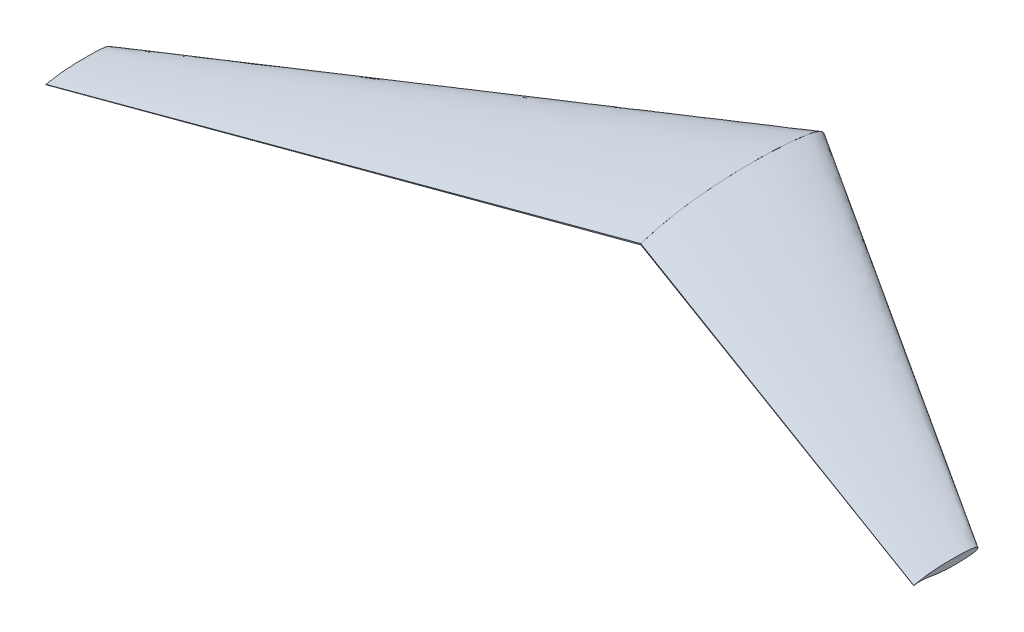
ISO-10303-21;
HEADER;
FILE_DESCRIPTION(('STEP AP214'),'2;1');
FILE_NAME('part.step','',(''),(''),'','','');
FILE_SCHEMA(('AUTOMOTIVE_DESIGN { 1 0 10303 214 1 1 1 1 }'));
ENDSEC;
DATA;
#1=APPLICATION_CONTEXT('core data for automotive mechanical design processes');
#2=APPLICATION_PROTOCOL_DEFINITION('international standard','automotive_design',2000,#1);
#3=PRODUCT_CONTEXT('',#1,'mechanical');
#4=PRODUCT('Part','Part','',(#3));
#5=PRODUCT_RELATED_PRODUCT_CATEGORY('part','',(#4));
#6=PRODUCT_DEFINITION_FORMATION('','',#4);
#7=PRODUCT_DEFINITION_CONTEXT('part definition',#1,'design');
#8=PRODUCT_DEFINITION('design','',#6,#7);
#9=PRODUCT_DEFINITION_SHAPE('','',#8);
#10=(LENGTH_UNIT() NAMED_UNIT(*) SI_UNIT(.MILLI.,.METRE.));
#11=(NAMED_UNIT(*) PLANE_ANGLE_UNIT() SI_UNIT($,.RADIAN.));
#12=(NAMED_UNIT(*) SI_UNIT($,.STERADIAN.) SOLID_ANGLE_UNIT());
#13=UNCERTAINTY_MEASURE_WITH_UNIT(LENGTH_MEASURE(1.E-05),#10,'distance_accuracy_value','');
#14=(GEOMETRIC_REPRESENTATION_CONTEXT(3) GLOBAL_UNCERTAINTY_ASSIGNED_CONTEXT((#13)) GLOBAL_UNIT_ASSIGNED_CONTEXT((#10,
#11,#12)) REPRESENTATION_CONTEXT('',''));
#15=CARTESIAN_POINT('',(0.,0.,0.));
#16=DIRECTION('',(0.,0.,1.));
#17=DIRECTION('',(1.,0.,0.));
#18=AXIS2_PLACEMENT_3D('',#15,#16,#17);
#19=CARTESIAN_POINT('',(0.,0.,0.));
#20=DIRECTION('',(1.,0.,0.));
#21=DIRECTION('',(0.,-0.0162840972649137,0.999867405297456));
#22=AXIS2_PLACEMENT_3D('',#19,#20,#21);
#23=PLANE('',#22);
#24=CARTESIAN_POINT('',(0.,0.,0.));
#25=CARTESIAN_POINT('',(0.,-168.219244985559,24.4306824349386));
#26=CARTESIAN_POINT('',(0.,-240.293252777775,157.991066940026));
#27=CARTESIAN_POINT('',(0.,-287.941682209285,301.889929005835));
#28=CARTESIAN_POINT('',(0.,-292.101499857276,314.960555971875));
#29=CARTESIAN_POINT('',(0.,-310.76378046373,374.505096564794));
#30=CARTESIAN_POINT('',(0.,-327.241640239006,436.068046062058));
#31=CARTESIAN_POINT('',(0.,-355.189334027052,557.429659927653));
#32=CARTESIAN_POINT('',(0.,-369.357094330206,632.30081132304));
#33=CARTESIAN_POINT('',(0.,-382.942468731832,713.000713621617));
#34=CARTESIAN_POINT('',(0.,-386.339419512408,733.843007246593));
#35=CARTESIAN_POINT('',(0.,-464.151707553221,1219.93749628057));
#36=CARTESIAN_POINT('',(0.,-497.989254236309,1718.43084410729));
#37=CARTESIAN_POINT('',(0.,-514.963696980453,2222.47962112165));
#38=CARTESIAN_POINT('',(0.,-515.506742264564,2239.10762908759));
#39=CARTESIAN_POINT('',(0.,-531.576610615847,2741.14533979813));
#40=CARTESIAN_POINT('',(0.,-531.338306486109,3237.12493062856));
#41=CARTESIAN_POINT('',(0.,-484.471823951836,3730.48170300638));
#42=CARTESIAN_POINT('',(0.,-483.443845808145,3741.1157622821));
#43=CARTESIAN_POINT('',(0.,-434.699780159024,4238.95693823703));
#44=CARTESIAN_POINT('',(0.,-338.479144088492,4727.75824414844));
#45=CARTESIAN_POINT('',(0.,-231.889492315737,5222.67458438554));
#46=CARTESIAN_POINT('',(0.,-230.091058568289,5231.0164483081));
#47=CARTESIAN_POINT('',(0.,-174.510415982621,5488.4887692628));
#48=CARTESIAN_POINT('',(0.,-5.08441114977858,6242.80148239056));
#49=CARTESIAN_POINT('',(0.,37.3131454345689,6997.03429239929));
#50=CARTESIAN_POINT('',(0.,-122.099983023939,7497.11766190782));
#51=B_SPLINE_CURVE_WITH_KNOTS('',3,(#24,#25,#26,#27,#28,#29,#30,#31,#32,#33,#34,#35,#36,#37,#38,
#39,#40,#41,#42,#43,#44,#45,#46,#47,#48,#49,#50),.UNSPECIFIED.,.F.,.F.,(4,1,1,1,1,1,1,1,1,1,1,1,
1,1,1,1,1,1,1,1,1,1,1,1,4),(0.,0.0516818959266183,0.0546217915879629,0.0563634907676497,
0.0568022946260039,0.0779742802769757,0.0808417609968839,0.105440526394511,0.108219422965478,
0.113370916210949,0.113833768892824,0.303753868139358,0.306383441939405,0.309593352148186,
0.310212468355379,0.501400140634165,0.503114766214556,0.504759280947049,0.50559428152025,
0.699493646754859,0.699693785804065,0.701848021766534,0.702801294739028,0.801775017183419,1.),.UNSPECIFIED.);
#52=CARTESIAN_POINT('',(0.,0.,0.));
#53=VERTEX_POINT('',#52);
#54=CARTESIAN_POINT('',(0.,-122.099983023939,7497.11766190782));
#55=VERTEX_POINT('',#54);
#56=EDGE_CURVE('E13',#53,#55,#51,.T.);
#57=ORIENTED_EDGE('',*,*,#56,.F.);
#58=CARTESIAN_POINT('',(0.,0.,0.));
#59=CARTESIAN_POINT('',(0.,147.744350315997,-1.87596635575002));
#60=CARTESIAN_POINT('',(0.,229.950494983549,150.159617470069));
#61=CARTESIAN_POINT('',(0.,283.89468774049,304.222194415367));
#62=CARTESIAN_POINT('',(0.,288.576874017886,318.12055456744));
#63=CARTESIAN_POINT('',(0.,309.494568260285,381.203954901813));
#64=CARTESIAN_POINT('',(0.,326.920125838408,444.214037180333));
#65=CARTESIAN_POINT('',(0.,354.958515805397,565.577583143327));
#66=CARTESIAN_POINT('',(0.,368.038013798109,638.61302207588));
#67=CARTESIAN_POINT('',(0.,380.410222664183,717.251532881619));
#68=CARTESIAN_POINT('',(0.,383.500957238236,737.571327655632));
#69=CARTESIAN_POINT('',(0.,454.59746271917,1212.13403568743));
#70=CARTESIAN_POINT('',(0.,494.430085188347,1719.94356679038));
#71=CARTESIAN_POINT('',(0.,512.783132070054,2227.12746801325));
#72=CARTESIAN_POINT('',(0.,513.366711958921,2243.85221273865));
#73=CARTESIAN_POINT('',(0.,530.55662166064,2748.66902372671));
#74=CARTESIAN_POINT('',(0.,526.204487529615,3240.45712521648));
#75=CARTESIAN_POINT('',(0.,508.019006864098,3736.75276621331));
#76=CARTESIAN_POINT('',(0.,507.621796677391,3747.45291604525));
#77=CARTESIAN_POINT('',(0.,488.846145002536,4248.48463209584));
#78=CARTESIAN_POINT('',(0.,456.331207739767,4747.931323017));
#79=CARTESIAN_POINT('',(0.,398.620723946864,5247.76477091847));
#80=CARTESIAN_POINT('',(0.,397.642967454545,5256.18831885992));
#81=CARTESIAN_POINT('',(0.,367.258396148628,5516.1319341748));
#82=CARTESIAN_POINT('',(0.,258.861807301948,6272.94786771452));
#83=CARTESIAN_POINT('',(0.,82.1439686634919,7014.10396158884));
#84=CARTESIAN_POINT('',(0.,-75.5439842046241,7497.11766190782));
#85=B_SPLINE_CURVE_WITH_KNOTS('',3,(#58,#59,#60,#61,#62,#63,#64,#65,#66,#67,#68,#69,#70,#71,#72,
#73,#74,#75,#76,#77,#78,#79,#80,#81,#82,#83,#84),.UNSPECIFIED.,.F.,.F.,(4,1,1,1,1,1,1,1,1,1,1,1,
1,1,1,1,1,1,1,1,1,1,1,1,4),(0.,0.0516818959266183,0.0546217915879629,0.0563634907676497,
0.0568022946260039,0.0779742802769757,0.0808417609968839,0.105440526394511,0.108219422965478,
0.113370916210949,0.113833768892824,0.303753868139358,0.306383441939405,0.309593352148186,
0.310212468355379,0.501400140634165,0.503114766214556,0.504759280947049,0.50559428152025,
0.699493646754859,0.699693785804065,0.701848021766534,0.702801294739028,0.801775017183419,1.),.UNSPECIFIED.);
#86=CARTESIAN_POINT('',(0.,-75.5439842046241,7497.11766190782));
#87=VERTEX_POINT('',#86);
#88=EDGE_CURVE('E89',#87,#53,#85,.F.);
#89=ORIENTED_EDGE('',*,*,#88,.F.);
#90=DIRECTION('',(0.,1.,0.));
#91=VECTOR('',#90,1.);
#92=CARTESIAN_POINT('',(0.,-98.8219836142816,7497.11766190782));
#93=LINE('',#92,#91);
#94=EDGE_CURVE('E74',#55,#87,#93,.T.);
#95=ORIENTED_EDGE('',*,*,#94,.F.);
#96=EDGE_LOOP('',(#57,#89,#95));
#97=FACE_BOUND('',#96,.T.);
#98=ADVANCED_FACE('F73',(#97),#23,.T.);
#99=OPEN_SHELL('',(#98));
#100=SHELL_BASED_SURFACE_MODEL('B2',(#99));
#101=CARTESIAN_POINT('',(-17711.940475464,-15.8130514374712,14068.2664031076));
#102=DIRECTION('',(-1.,0.,0.));
#103=DIRECTION('',(0.,0.00602622616138376,-0.999981842134272));
#104=AXIS2_PLACEMENT_3D('',#101,#102,#103);
#105=PLANE('',#104);
#106=CARTESIAN_POINT('',(-17711.940475464,-15.8130514374712,14068.2664031076));
#107=CARTESIAN_POINT('',(-17711.940475464,41.3944573956827,13808.8497174991));
#108=CARTESIAN_POINT('',(-17711.940475464,81.3294975090124,13545.1127401605));
#109=CARTESIAN_POINT('',(-17711.940475464,118.313912795888,13108.497152444));
#110=CARTESIAN_POINT('',(-17711.940475464,125.638180271525,12933.165113035));
#111=CARTESIAN_POINT('',(-17711.940475464,132.289914098428,12587.9188844221));
#112=CARTESIAN_POINT('',(-17711.940475464,131.845992853705,12409.687296129));
#113=CARTESIAN_POINT('',(-17711.940475464,126.798865744636,12067.3135180284));
#114=CARTESIAN_POINT('',(-17711.940475464,122.008531395881,11888.0995964154));
#115=CARTESIAN_POINT('',(-17711.940475464,95.2060162132103,11687.3207423543));
#116=CARTESIAN_POINT('',(-17711.940475464,87.4335696718086,11636.5027445196));
#117=CARTESIAN_POINT('',(-17711.940475464,82.8166994266646,11592.776350498));
#118=CARTESIAN_POINT('',(-17711.940475464,62.8941371107513,11520.2820314438));
#119=CARTESIAN_POINT('',(-17711.940475464,22.8509522508046,11449.683428606));
#120=CARTESIAN_POINT('',(-17711.940475464,0.,11444.2752214398));
#121=B_SPLINE_CURVE_WITH_KNOTS('',3,(#106,#107,#108,#109,#110,#111,#112,#113,#114,#115,#116,
#117,#118,#119,#120),.UNSPECIFIED.,.F.,.F.,(4,1,1,1,1,1,1,1,1,1,1,1,4),(0.,0.300306214195935,
0.300506353245141,0.495240719052951,0.498599859365835,0.690406647851814,0.696246131860642,
0.886629083789051,0.894559473605489,0.922025719723024,0.94363650923235,0.948318104073382,1.),.UNSPECIFIED.);
#122=CARTESIAN_POINT('',(-17711.940475464,0.,11444.2752214398));
#123=VERTEX_POINT('',#122);
#124=CARTESIAN_POINT('',(-17711.940475464,-15.8130514374712,14068.2664031076));
#125=VERTEX_POINT('',#124);
#126=EDGE_CURVE('E230',#123,#125,#121,.F.);
#127=ORIENTED_EDGE('',*,*,#126,.F.);
#128=CARTESIAN_POINT('',(-17711.940475464,0.,11444.2752214398));
#129=CARTESIAN_POINT('',(-17711.940475464,-47.818557129653,11446.9972277219));
#130=CARTESIAN_POINT('',(-17711.940475464,-63.0903884514529,11514.9937546275));
#131=CARTESIAN_POINT('',(-17711.940475464,-78.3886634121315,11590.3487551736));
#132=CARTESIAN_POINT('',(-17711.940475464,-86.6397036490906,11634.4554990894));
#133=CARTESIAN_POINT('',(-17711.940475464,-93.2729643868783,11685.3168945833));
#134=CARTESIAN_POINT('',(-17711.940475464,-116.962708154297,11886.0989316644));
#135=CARTESIAN_POINT('',(-17711.940475464,-124.768790117039,12064.06661987));
#136=CARTESIAN_POINT('',(-17711.940475464,-131.747537065342,12408.7396195625));
#137=CARTESIAN_POINT('',(-17711.940475464,-131.076895392797,12585.9621770555));
#138=CARTESIAN_POINT('',(-17711.940475464,-110.923731359257,12933.1723140875));
#139=CARTESIAN_POINT('',(-17711.940475464,-90.8918341756138,13109.5736224428));
#140=CARTESIAN_POINT('',(-17711.940475464,-48.2087782371968,13368.8391971416));
#141=CARTESIAN_POINT('',(-17711.940475464,1.18684815978902,13628.6530130911));
#142=CARTESIAN_POINT('',(-17711.940475464,11.6483985730418,13895.1026446759));
#143=CARTESIAN_POINT('',(-17711.940475464,-29.3719819061615,14068.2664031076));
#144=B_SPLINE_CURVE_WITH_KNOTS('',3,(#128,#129,#130,#131,#132,#133,#134,#135,#136,#137,#138,
#139,#140,#141,#142,#143),.UNSPECIFIED.,.F.,.F.,(4,1,1,1,1,1,1,1,1,1,1,1,1,4),(0.,
0.0546217915879629,0.0568022946260039,0.0808417609968839,0.108219422965478,0.113833768892824,
0.306383441939405,0.310212468355379,0.503114766214556,0.50559428152025,0.701848021766534,
0.702801294739028,0.801775017183419,1.),.UNSPECIFIED.);
#145=CARTESIAN_POINT('',(-17711.940475464,-29.3719819061615,14068.2664031076));
#146=VERTEX_POINT('',#145);
#147=EDGE_CURVE('E162',#146,#123,#144,.F.);
#148=ORIENTED_EDGE('',*,*,#147,.F.);
#149=DIRECTION('',(0.,-1.,0.));
#150=VECTOR('',#149,1.);
#151=CARTESIAN_POINT('',(-17711.940475464,-15.8130514374713,14068.2664031076));
#152=LINE('',#151,#150);
#153=EDGE_CURVE('E130',#125,#146,#152,.T.);
#154=ORIENTED_EDGE('',*,*,#153,.F.);
#155=EDGE_LOOP('',(#127,#148,#154));
#156=FACE_BOUND('',#155,.T.);
#157=ADVANCED_FACE('F127',(#156),#105,.T.);
#158=CARTESIAN_POINT('',(17711.940475464,-15.8130514374712,14068.2664031076));
#159=DIRECTION('',(1.,0.,0.));
#160=DIRECTION('',(0.,0.00602622616138376,-0.999981842134272));
#161=AXIS2_PLACEMENT_3D('',#158,#159,#160);
#162=PLANE('',#161);
#163=CARTESIAN_POINT('',(17711.940475464,-15.8130514374712,14068.2664031076));
#164=CARTESIAN_POINT('',(17711.940475464,41.3944573956827,13808.8497174991));
#165=CARTESIAN_POINT('',(17711.940475464,81.3294975090124,13545.1127401605));
#166=CARTESIAN_POINT('',(17711.940475464,118.313912795888,13108.497152444));
#167=CARTESIAN_POINT('',(17711.940475464,125.638180271525,12933.165113035));
#168=CARTESIAN_POINT('',(17711.940475464,132.289914098428,12587.9188844221));
#169=CARTESIAN_POINT('',(17711.940475464,131.845992853705,12409.687296129));
#170=CARTESIAN_POINT('',(17711.940475464,126.798865744636,12067.3135180284));
#171=CARTESIAN_POINT('',(17711.940475464,122.008531395881,11888.0995964154));
#172=CARTESIAN_POINT('',(17711.940475464,95.2060162132103,11687.3207423543));
#173=CARTESIAN_POINT('',(17711.940475464,87.4335696718086,11636.5027445196));
#174=CARTESIAN_POINT('',(17711.940475464,82.8166994266646,11592.776350498));
#175=CARTESIAN_POINT('',(17711.940475464,62.8941371107513,11520.2820314438));
#176=CARTESIAN_POINT('',(17711.940475464,22.8509522508046,11449.683428606));
#177=CARTESIAN_POINT('',(17711.940475464,0.,11444.2752214398));
#178=B_SPLINE_CURVE_WITH_KNOTS('',3,(#163,#164,#165,#166,#167,#168,#169,#170,#171,#172,#173,
#174,#175,#176,#177),.UNSPECIFIED.,.F.,.F.,(4,1,1,1,1,1,1,1,1,1,1,1,4),(0.,0.300306214195935,
0.300506353245141,0.495240719052951,0.498599859365835,0.690406647851814,0.696246131860642,
0.886629083789051,0.894559473605489,0.922025719723024,0.94363650923235,0.948318104073382,1.),.UNSPECIFIED.);
#179=CARTESIAN_POINT('',(17711.940475464,0.,11444.2752214398));
#180=VERTEX_POINT('',#179);
#181=CARTESIAN_POINT('',(17711.940475464,-15.8130514374712,14068.2664031076));
#182=VERTEX_POINT('',#181);
#183=EDGE_CURVE('E179',#180,#182,#178,.F.);
#184=ORIENTED_EDGE('',*,*,#183,.T.);
#185=DIRECTION('',(0.,-1.,0.));
#186=VECTOR('',#185,1.);
#187=CARTESIAN_POINT('',(17711.940475464,-15.8130514374713,14068.2664031076));
#188=LINE('',#187,#186);
#189=CARTESIAN_POINT('',(17711.940475464,-29.3719819061615,14068.2664031076));
#190=VERTEX_POINT('',#189);
#191=EDGE_CURVE('E137',#182,#190,#188,.T.);
#192=ORIENTED_EDGE('',*,*,#191,.T.);
#193=CARTESIAN_POINT('',(17711.940475464,0.,11444.2752214398));
#194=CARTESIAN_POINT('',(17711.940475464,-47.818557129653,11446.9972277219));
#195=CARTESIAN_POINT('',(17711.940475464,-63.0903884514529,11514.9937546275));
#196=CARTESIAN_POINT('',(17711.940475464,-78.3886634121315,11590.3487551736));
#197=CARTESIAN_POINT('',(17711.940475464,-86.6397036490906,11634.4554990894));
#198=CARTESIAN_POINT('',(17711.940475464,-93.2729643868783,11685.3168945833));
#199=CARTESIAN_POINT('',(17711.940475464,-116.962708154297,11886.0989316644));
#200=CARTESIAN_POINT('',(17711.940475464,-124.768790117039,12064.06661987));
#201=CARTESIAN_POINT('',(17711.940475464,-131.747537065342,12408.7396195625));
#202=CARTESIAN_POINT('',(17711.940475464,-131.076895392797,12585.9621770555));
#203=CARTESIAN_POINT('',(17711.940475464,-110.923731359257,12933.1723140875));
#204=CARTESIAN_POINT('',(17711.940475464,-90.8918341756138,13109.5736224428));
#205=CARTESIAN_POINT('',(17711.940475464,-48.2087782371968,13368.8391971416));
#206=CARTESIAN_POINT('',(17711.940475464,1.18684815978902,13628.6530130911));
#207=CARTESIAN_POINT('',(17711.940475464,11.6483985730418,13895.1026446759));
#208=CARTESIAN_POINT('',(17711.940475464,-29.3719819061615,14068.2664031076));
#209=B_SPLINE_CURVE_WITH_KNOTS('',3,(#193,#194,#195,#196,#197,#198,#199,#200,#201,#202,#203,
#204,#205,#206,#207,#208),.UNSPECIFIED.,.F.,.F.,(4,1,1,1,1,1,1,1,1,1,1,1,1,4),(0.,
0.0546217915879629,0.0568022946260039,0.0808417609968839,0.108219422965478,0.113833768892824,
0.306383441939405,0.310212468355379,0.503114766214556,0.50559428152025,0.701848021766534,
0.702801294739028,0.801775017183419,1.),.UNSPECIFIED.);
#210=EDGE_CURVE('E175',#190,#180,#209,.F.);
#211=ORIENTED_EDGE('',*,*,#210,.T.);
#212=EDGE_LOOP('',(#184,#192,#211));
#213=FACE_BOUND('',#212,.T.);
#214=ADVANCED_FACE('F177',(#213),#162,.T.);
#215=CARTESIAN_POINT('',(2444.91600832248,0.,6590.05122428721));
#216=DIRECTION('',(0.34783428390117,0.,0.937556030828537));
#217=DIRECTION('',(0.937556030828537,0.,-0.34783428390117));
#218=AXIS2_PLACEMENT_3D('',#215,#216,#217);
#219=PLANE('',#218);
#220=DIRECTION('',(0.937551344586137,-0.00316175499837554,-0.347832545300259));
#221=VECTOR('',#220,1.);
#222=CARTESIAN_POINT('',(-8855.970237732,-45.6785178210476,10782.6920325077));
#223=LINE('',#222,#221);
#224=CARTESIAN_POINT('',(0.,-75.5439842046241,7497.11766190782));
#225=VERTEX_POINT('',#224);
#226=EDGE_CURVE('E236',#125,#225,#223,.T.);
#227=ORIENTED_EDGE('',*,*,#226,.F.);
#228=ORIENTED_EDGE('',*,*,#153,.T.);
#229=DIRECTION('',(-0.937544736943559,0.00490836391053259,0.34783009385784));
#230=VECTOR('',#229,1.);
#231=CARTESIAN_POINT('',(-8855.970237732,-75.7359824650503,10782.6920325077));
#232=LINE('',#231,#230);
#233=CARTESIAN_POINT('',(0.,-122.099983023939,7497.11766190782));
#234=VERTEX_POINT('',#233);
#235=EDGE_CURVE('E246',#234,#146,#232,.T.);
#236=ORIENTED_EDGE('',*,*,#235,.F.);
#237=DIRECTION('',(0.,-1.,0.));
#238=VECTOR('',#237,1.);
#239=CARTESIAN_POINT('',(0.,-75.5439842046226,7497.11766190782));
#240=LINE('',#239,#238);
#241=EDGE_CURVE('E71',#225,#234,#240,.T.);
#242=ORIENTED_EDGE('',*,*,#241,.F.);
#243=EDGE_LOOP('',(#227,#228,#236,#242));
#244=FACE_BOUND('',#243,.T.);
#245=ADVANCED_FACE('F255',(#244),#219,.T.);
#246=CARTESIAN_POINT('',(0.,0.,0.));
#247=CARTESIAN_POINT('',(-17711.940475464,0.,11444.2752214398));
#248=CARTESIAN_POINT('',(0.,-177.788302382174,25.8204081020493));
#249=CARTESIAN_POINT('',(-17711.940475464,-47.818557129653,11446.9972277219));
#250=CARTESIAN_POINT('',(0.,-246.485948710704,171.085912968349));
#251=CARTESIAN_POINT('',(-17711.940475464,-63.0903884514529,11514.9937546275));
#252=CARTESIAN_POINT('',(0.,-311.912015004825,377.44430817759));
#253=CARTESIAN_POINT('',(-17711.940475464,-78.3886634121315,11590.3487551736));
#254=CARTESIAN_POINT('',(0.,-347.09591396304,511.99499932436));
#255=CARTESIAN_POINT('',(-17711.940475464,-86.6397036490906,11634.4554990894));
#256=CARTESIAN_POINT('',(0.,-373.198588527806,653.061349223909));
#257=CARTESIAN_POINT('',(-17711.940475464,-93.2729643868783,11685.3168945833));
#258=CARTESIAN_POINT('',(0.,-464.310856576101,1213.16292025647));
#259=CARTESIAN_POINT('',(-17711.940475464,-116.962708154297,11886.0989316644));
#260=CARTESIAN_POINT('',(0.,-499.101668502809,1735.12009555467));
#261=CARTESIAN_POINT('',(-17711.940475464,-124.768790117039,12064.06661987));
#262=CARTESIAN_POINT('',(0.,-531.724252638484,2737.33294474881));
#263=CARTESIAN_POINT('',(-17711.940475464,-131.747537065342,12408.7396195625));
#264=CARTESIAN_POINT('',(0.,-531.33000610697,3247.87374350738));
#265=CARTESIAN_POINT('',(-17711.940475464,-131.076895392797,12585.9621770555));
#266=CARTESIAN_POINT('',(0.,-434.932009966432,4240.80242948856));
#267=CARTESIAN_POINT('',(-17711.940475464,-110.923731359257,12933.1723140875));
#268=CARTESIAN_POINT('',(0.,-335.773317959958,4741.45289985921));
#269=CARTESIAN_POINT('',(-17711.940475464,-90.8918341756138,13109.5736224428));
#270=CARTESIAN_POINT('',(0.,-174.510415982621,5488.4887692628));
#271=CARTESIAN_POINT('',(-17711.940475464,-48.2087782371968,13368.8391971416));
#272=CARTESIAN_POINT('',(0.,-5.08441114977858,6242.80148239056));
#273=CARTESIAN_POINT('',(-17711.940475464,1.18684815978902,13628.6530130911));
#274=CARTESIAN_POINT('',(0.,37.3131454345689,6997.03429239929));
#275=CARTESIAN_POINT('',(-17711.940475464,11.6483985730418,13895.1026446759));
#276=CARTESIAN_POINT('',(0.,-122.099983023939,7497.11766190782));
#277=CARTESIAN_POINT('',(-17711.940475464,-29.3719819061615,14068.2664031076));
#278=B_SPLINE_SURFACE_WITH_KNOTS('',3,1,((#246,#247),(#248,#249),(#250,#251),(#252,#253),(#254,
#255),(#256,#257),(#258,#259),(#260,#261),(#262,#263),(#264,#265),(#266,#267),(#268,#269),(#270,
#271),(#272,#273),(#274,#275),(#276,#277)),.UNSPECIFIED.,.F.,.F.,.F.,(4,1,1,1,1,1,1,1,1,1,1,1,1,
4),(2,2),(0.,0.0546217915879629,0.0568022946260039,0.0808417609968839,0.108219422965478,
0.113833768892824,0.306383441939405,0.310212468355379,0.503114766214556,0.50559428152025,
0.701848021766534,0.702801294739028,0.801775017183419,1.),(0.,1.),.UNSPECIFIED.);
#279=CARTESIAN_POINT('',(0.,0.,0.));
#280=CARTESIAN_POINT('',(0.,-177.788302382174,25.8204081020493));
#281=CARTESIAN_POINT('',(0.,-246.485948710704,171.085912968349));
#282=CARTESIAN_POINT('',(0.,-311.912015004825,377.44430817759));
#283=CARTESIAN_POINT('',(0.,-347.09591396304,511.99499932436));
#284=CARTESIAN_POINT('',(0.,-373.198588527806,653.061349223909));
#285=CARTESIAN_POINT('',(0.,-464.310856576101,1213.16292025647));
#286=CARTESIAN_POINT('',(0.,-499.101668502809,1735.12009555467));
#287=CARTESIAN_POINT('',(0.,-531.724252638484,2737.33294474881));
#288=CARTESIAN_POINT('',(0.,-531.33000610697,3247.87374350738));
#289=CARTESIAN_POINT('',(0.,-434.932009966432,4240.80242948856));
#290=CARTESIAN_POINT('',(0.,-335.773317959958,4741.45289985921));
#291=CARTESIAN_POINT('',(0.,-174.510415982621,5488.4887692628));
#292=CARTESIAN_POINT('',(0.,-5.08441114977858,6242.80148239056));
#293=CARTESIAN_POINT('',(0.,37.3131454345689,6997.03429239929));
#294=CARTESIAN_POINT('',(0.,-122.099983023939,7497.11766190782));
#295=B_SPLINE_CURVE_WITH_KNOTS('',3,(#279,#280,#281,#282,#283,#284,#285,#286,#287,#288,#289,
#290,#291,#292,#293,#294),.UNSPECIFIED.,.F.,.F.,(4,1,1,1,1,1,1,1,1,1,1,1,1,4),(0.,
0.0546217915879629,0.0568022946260039,0.0808417609968839,0.108219422965478,0.113833768892824,
0.306383441939405,0.310212468355379,0.503114766214556,0.50559428152025,0.701848021766534,
0.702801294739028,0.801775017183419,1.),.UNSPECIFIED.);
#296=CARTESIAN_POINT('',(0.,0.,0.));
#297=VERTEX_POINT('',#296);
#298=EDGE_CURVE('E190',#297,#234,#295,.T.);
#299=DIRECTION('',(-0.83992452032518,0.,0.542703233965412));
#300=VECTOR('',#299,1.);
#301=CARTESIAN_POINT('',(-8855.970237732,0.,5722.13761071991));
#302=LINE('',#301,#300);
#303=EDGE_CURVE('E235',#297,#123,#302,.T.);
#304=ORIENTED_EDGE('',*,*,#298,.T.);
#305=ORIENTED_EDGE('',*,*,#235,.T.);
#306=ORIENTED_EDGE('',*,*,#147,.T.);
#307=ORIENTED_EDGE('',*,*,#303,.F.);
#308=EDGE_LOOP('',(#304,#305,#306,#307));
#309=FACE_BOUND('',#308,.T.);
#310=ADVANCED_FACE('F307',(#309),#278,.T.);
#311=CARTESIAN_POINT('',(0.,-75.5439842046241,7497.11766190782));
#312=CARTESIAN_POINT('',(-17711.940475464,-15.8130514374712,14068.2664031076));
#313=CARTESIAN_POINT('',(0.,163.349577430584,6765.36319944543));
#314=CARTESIAN_POINT('',(-17711.940475464,41.3944573956827,13808.8497174991));
#315=CARTESIAN_POINT('',(0.,310.945987730007,6007.12013959609));
#316=CARTESIAN_POINT('',(-17711.940475464,81.3294975090124,13545.1127401605));
#317=CARTESIAN_POINT('',(0.,456.576748471813,4745.80468219487));
#318=CARTESIAN_POINT('',(-17711.940475464,118.313912795888,13108.497152444));
#319=CARTESIAN_POINT('',(0.,489.54342857293,4237.73844104663));
#320=CARTESIAN_POINT('',(-17711.940475464,125.638180271525,12933.165113035));
#321=CARTESIAN_POINT('',(0.,526.225751024995,3243.05682521399));
#322=CARTESIAN_POINT('',(-17711.940475464,132.289914098428,12587.9188844221));
#323=CARTESIAN_POINT('',(0.,530.700398686078,2732.25624821552));
#324=CARTESIAN_POINT('',(-17711.940475464,131.845992853705,12409.687296129));
#325=CARTESIAN_POINT('',(0.,495.049999949291,1727.18986093902));
#326=CARTESIAN_POINT('',(-17711.940475464,126.798865744636,12067.3135180284));
#327=CARTESIAN_POINT('',(0.,452.863049777549,1190.05088466301));
#328=CARTESIAN_POINT('',(-17711.940475464,122.008531395881,11888.0995964154));
#329=CARTESIAN_POINT('',(0.,369.203265791287,644.119232099813));
#330=CARTESIAN_POINT('',(-17711.940475464,95.2060162132103,11687.3207423543));
#331=CARTESIAN_POINT('',(0.,344.239306000903,506.474796896507));
#332=CARTESIAN_POINT('',(-17711.940475464,87.4335696718086,11636.5027445196));
#333=CARTESIAN_POINT('',(0.,305.836809672672,368.0160442172));
#334=CARTESIAN_POINT('',(-17711.940475464,82.8166994266646,11592.776350498));
#335=CARTESIAN_POINT('',(0.,232.571763355937,155.007504072364));
#336=CARTESIAN_POINT('',(-17711.940475464,62.8941371107513,11520.2820314438));
#337=CARTESIAN_POINT('',(0.,147.744350315997,-1.87596635575002));
#338=CARTESIAN_POINT('',(-17711.940475464,22.8509522508046,11449.683428606));
#339=CARTESIAN_POINT('',(0.,0.,0.));
#340=CARTESIAN_POINT('',(-17711.940475464,0.,11444.2752214398));
#341=B_SPLINE_SURFACE_WITH_KNOTS('',3,1,((#311,#312),(#313,#314),(#315,#316),(#317,#318),(#319,
#320),(#321,#322),(#323,#324),(#325,#326),(#327,#328),(#329,#330),(#331,#332),(#333,#334),(#335,
#336),(#337,#338),(#339,#340)),.UNSPECIFIED.,.F.,.F.,.F.,(4,1,1,1,1,1,1,1,1,1,1,1,4),(2,2),(0.,
0.300306214195935,0.300506353245141,0.495240719052951,0.498599859365835,0.690406647851814,
0.696246131860642,0.886629083789051,0.894559473605489,0.922025719723024,0.94363650923235,
0.948318104073382,1.),(0.,1.),.UNSPECIFIED.);
#342=CARTESIAN_POINT('',(0.,-75.5439842046241,7497.11766190782));
#343=CARTESIAN_POINT('',(0.,163.349577430584,6765.36319944543));
#344=CARTESIAN_POINT('',(0.,310.945987730007,6007.12013959609));
#345=CARTESIAN_POINT('',(0.,456.576748471813,4745.80468219487));
#346=CARTESIAN_POINT('',(0.,489.54342857293,4237.73844104663));
#347=CARTESIAN_POINT('',(0.,526.225751024995,3243.05682521399));
#348=CARTESIAN_POINT('',(0.,530.700398686078,2732.25624821552));
#349=CARTESIAN_POINT('',(0.,495.049999949291,1727.18986093902));
#350=CARTESIAN_POINT('',(0.,452.863049777549,1190.05088466301));
#351=CARTESIAN_POINT('',(0.,369.203265791287,644.119232099813));
#352=CARTESIAN_POINT('',(0.,344.239306000903,506.474796896507));
#353=CARTESIAN_POINT('',(0.,305.836809672672,368.0160442172));
#354=CARTESIAN_POINT('',(0.,232.571763355937,155.007504072364));
#355=CARTESIAN_POINT('',(0.,147.744350315997,-1.87596635575002));
#356=CARTESIAN_POINT('',(0.,0.,0.));
#357=B_SPLINE_CURVE_WITH_KNOTS('',3,(#342,#343,#344,#345,#346,#347,#348,#349,#350,#351,#352,
#353,#354,#355,#356),.UNSPECIFIED.,.F.,.F.,(4,1,1,1,1,1,1,1,1,1,1,1,4),(0.,0.300306214195935,
0.300506353245141,0.495240719052951,0.498599859365835,0.690406647851814,0.696246131860642,
0.886629083789051,0.894559473605489,0.922025719723024,0.94363650923235,0.948318104073382,1.),.UNSPECIFIED.);
#358=EDGE_CURVE('E184',#225,#297,#357,.T.);
#359=ORIENTED_EDGE('',*,*,#358,.T.);
#360=ORIENTED_EDGE('',*,*,#303,.T.);
#361=ORIENTED_EDGE('',*,*,#126,.T.);
#362=ORIENTED_EDGE('',*,*,#226,.T.);
#363=EDGE_LOOP('',(#359,#360,#361,#362));
#364=FACE_BOUND('',#363,.T.);
#365=ADVANCED_FACE('F257',(#364),#341,.T.);
#366=CARTESIAN_POINT('',(-2444.91600832248,0.,6590.05122428721));
#367=DIRECTION('',(-0.34783428390117,0.,0.937556030828537));
#368=DIRECTION('',(-0.937556030828537,0.,-0.34783428390117));
#369=AXIS2_PLACEMENT_3D('',#366,#367,#368);
#370=PLANE('',#369);
#371=DIRECTION('',(-0.937551344586137,-0.00316175499837554,-0.347832545300259));
#372=VECTOR('',#371,1.);
#373=CARTESIAN_POINT('',(8855.970237732,-45.6785178210476,10782.6920325077));
#374=LINE('',#373,#372);
#375=EDGE_CURVE('E197',#182,#225,#374,.T.);
#376=ORIENTED_EDGE('',*,*,#375,.T.);
#377=ORIENTED_EDGE('',*,*,#241,.T.);
#378=DIRECTION('',(0.937544736943559,0.00490836391053259,0.34783009385784));
#379=VECTOR('',#378,1.);
#380=CARTESIAN_POINT('',(8855.970237732,-75.7359824650503,10782.6920325077));
#381=LINE('',#380,#379);
#382=EDGE_CURVE('E183',#234,#190,#381,.T.);
#383=ORIENTED_EDGE('',*,*,#382,.T.);
#384=ORIENTED_EDGE('',*,*,#191,.F.);
#385=EDGE_LOOP('',(#376,#377,#383,#384));
#386=FACE_BOUND('',#385,.T.);
#387=ADVANCED_FACE('F260',(#386),#370,.T.);
#388=CARTESIAN_POINT('',(0.,0.,0.));
#389=CARTESIAN_POINT('',(17711.940475464,0.,11444.2752214398));
#390=CARTESIAN_POINT('',(0.,-177.788302382174,25.8204081020493));
#391=CARTESIAN_POINT('',(17711.940475464,-47.818557129653,11446.9972277219));
#392=CARTESIAN_POINT('',(0.,-246.485948710704,171.085912968349));
#393=CARTESIAN_POINT('',(17711.940475464,-63.0903884514529,11514.9937546275));
#394=CARTESIAN_POINT('',(0.,-311.912015004825,377.44430817759));
#395=CARTESIAN_POINT('',(17711.940475464,-78.3886634121315,11590.3487551736));
#396=CARTESIAN_POINT('',(0.,-347.09591396304,511.99499932436));
#397=CARTESIAN_POINT('',(17711.940475464,-86.6397036490906,11634.4554990894));
#398=CARTESIAN_POINT('',(0.,-373.198588527806,653.061349223909));
#399=CARTESIAN_POINT('',(17711.940475464,-93.2729643868783,11685.3168945833));
#400=CARTESIAN_POINT('',(0.,-464.310856576101,1213.16292025647));
#401=CARTESIAN_POINT('',(17711.940475464,-116.962708154297,11886.0989316644));
#402=CARTESIAN_POINT('',(0.,-499.101668502809,1735.12009555467));
#403=CARTESIAN_POINT('',(17711.940475464,-124.768790117039,12064.06661987));
#404=CARTESIAN_POINT('',(0.,-531.724252638484,2737.33294474881));
#405=CARTESIAN_POINT('',(17711.940475464,-131.747537065342,12408.7396195625));
#406=CARTESIAN_POINT('',(0.,-531.33000610697,3247.87374350738));
#407=CARTESIAN_POINT('',(17711.940475464,-131.076895392797,12585.9621770555));
#408=CARTESIAN_POINT('',(0.,-434.932009966432,4240.80242948856));
#409=CARTESIAN_POINT('',(17711.940475464,-110.923731359257,12933.1723140875));
#410=CARTESIAN_POINT('',(0.,-335.773317959958,4741.45289985921));
#411=CARTESIAN_POINT('',(17711.940475464,-90.8918341756138,13109.5736224428));
#412=CARTESIAN_POINT('',(0.,-174.510415982621,5488.4887692628));
#413=CARTESIAN_POINT('',(17711.940475464,-48.2087782371968,13368.8391971416));
#414=CARTESIAN_POINT('',(0.,-5.08441114977858,6242.80148239056));
#415=CARTESIAN_POINT('',(17711.940475464,1.18684815978902,13628.6530130911));
#416=CARTESIAN_POINT('',(0.,37.3131454345689,6997.03429239929));
#417=CARTESIAN_POINT('',(17711.940475464,11.6483985730418,13895.1026446759));
#418=CARTESIAN_POINT('',(0.,-122.099983023939,7497.11766190782));
#419=CARTESIAN_POINT('',(17711.940475464,-29.3719819061615,14068.2664031076));
#420=B_SPLINE_SURFACE_WITH_KNOTS('',3,1,((#388,#389),(#390,#391),(#392,#393),(#394,#395),(#396,
#397),(#398,#399),(#400,#401),(#402,#403),(#404,#405),(#406,#407),(#408,#409),(#410,#411),(#412,
#413),(#414,#415),(#416,#417),(#418,#419)),.UNSPECIFIED.,.F.,.F.,.F.,(4,1,1,1,1,1,1,1,1,1,1,1,1,
4),(2,2),(0.,0.0546217915879629,0.0568022946260039,0.0808417609968839,0.108219422965478,
0.113833768892824,0.306383441939405,0.310212468355379,0.503114766214556,0.50559428152025,
0.701848021766534,0.702801294739028,0.801775017183419,1.),(0.,1.),.UNSPECIFIED.);
#421=DIRECTION('',(0.83992452032518,0.,0.542703233965412));
#422=VECTOR('',#421,1.);
#423=CARTESIAN_POINT('',(8855.970237732,0.,5722.13761071991));
#424=LINE('',#423,#422);
#425=EDGE_CURVE('E188',#297,#180,#424,.T.);
#426=ORIENTED_EDGE('',*,*,#298,.F.);
#427=ORIENTED_EDGE('',*,*,#425,.T.);
#428=ORIENTED_EDGE('',*,*,#210,.F.);
#429=ORIENTED_EDGE('',*,*,#382,.F.);
#430=EDGE_LOOP('',(#426,#427,#428,#429));
#431=FACE_BOUND('',#430,.T.);
#432=ADVANCED_FACE('F189',(#431),#420,.F.);
#433=CARTESIAN_POINT('',(0.,-75.5439842046241,7497.11766190782));
#434=CARTESIAN_POINT('',(17711.940475464,-15.8130514374712,14068.2664031076));
#435=CARTESIAN_POINT('',(0.,163.349577430584,6765.36319944543));
#436=CARTESIAN_POINT('',(17711.940475464,41.3944573956827,13808.8497174991));
#437=CARTESIAN_POINT('',(0.,310.945987730007,6007.12013959609));
#438=CARTESIAN_POINT('',(17711.940475464,81.3294975090124,13545.1127401605));
#439=CARTESIAN_POINT('',(0.,456.576748471813,4745.80468219487));
#440=CARTESIAN_POINT('',(17711.940475464,118.313912795888,13108.497152444));
#441=CARTESIAN_POINT('',(0.,489.54342857293,4237.73844104663));
#442=CARTESIAN_POINT('',(17711.940475464,125.638180271525,12933.165113035));
#443=CARTESIAN_POINT('',(0.,526.225751024995,3243.05682521399));
#444=CARTESIAN_POINT('',(17711.940475464,132.289914098428,12587.9188844221));
#445=CARTESIAN_POINT('',(0.,530.700398686078,2732.25624821552));
#446=CARTESIAN_POINT('',(17711.940475464,131.845992853705,12409.687296129));
#447=CARTESIAN_POINT('',(0.,495.049999949291,1727.18986093902));
#448=CARTESIAN_POINT('',(17711.940475464,126.798865744636,12067.3135180284));
#449=CARTESIAN_POINT('',(0.,452.863049777549,1190.05088466301));
#450=CARTESIAN_POINT('',(17711.940475464,122.008531395881,11888.0995964154));
#451=CARTESIAN_POINT('',(0.,369.203265791287,644.119232099813));
#452=CARTESIAN_POINT('',(17711.940475464,95.2060162132103,11687.3207423543));
#453=CARTESIAN_POINT('',(0.,344.239306000903,506.474796896507));
#454=CARTESIAN_POINT('',(17711.940475464,87.4335696718086,11636.5027445196));
#455=CARTESIAN_POINT('',(0.,305.836809672672,368.0160442172));
#456=CARTESIAN_POINT('',(17711.940475464,82.8166994266646,11592.776350498));
#457=CARTESIAN_POINT('',(0.,232.571763355937,155.007504072364));
#458=CARTESIAN_POINT('',(17711.940475464,62.8941371107513,11520.2820314438));
#459=CARTESIAN_POINT('',(0.,147.744350315997,-1.87596635575002));
#460=CARTESIAN_POINT('',(17711.940475464,22.8509522508046,11449.683428606));
#461=CARTESIAN_POINT('',(0.,0.,0.));
#462=CARTESIAN_POINT('',(17711.940475464,0.,11444.2752214398));
#463=B_SPLINE_SURFACE_WITH_KNOTS('',3,1,((#433,#434),(#435,#436),(#437,#438),(#439,#440),(#441,
#442),(#443,#444),(#445,#446),(#447,#448),(#449,#450),(#451,#452),(#453,#454),(#455,#456),(#457,
#458),(#459,#460),(#461,#462)),.UNSPECIFIED.,.F.,.F.,.F.,(4,1,1,1,1,1,1,1,1,1,1,1,4),(2,2),(0.,
0.300306214195935,0.300506353245141,0.495240719052951,0.498599859365835,0.690406647851814,
0.696246131860642,0.886629083789051,0.894559473605489,0.922025719723024,0.94363650923235,
0.948318104073382,1.),(0.,1.),.UNSPECIFIED.);
#464=ORIENTED_EDGE('',*,*,#358,.F.);
#465=ORIENTED_EDGE('',*,*,#375,.F.);
#466=ORIENTED_EDGE('',*,*,#183,.F.);
#467=ORIENTED_EDGE('',*,*,#425,.F.);
#468=EDGE_LOOP('',(#464,#465,#466,#467));
#469=FACE_BOUND('',#468,.T.);
#470=ADVANCED_FACE('F195',(#469),#463,.F.);
#471=CLOSED_SHELL('',(#157,#214,#245,#310,#365,#387,#432,#470));
#472=MANIFOLD_SOLID_BREP('B7',#471);
#473=CARTESIAN_POINT('',(0.,0.,0.));
#474=DIRECTION('',(-1.,0.,0.));
#475=DIRECTION('',(0.,-0.0162840972649137,0.999867405297456));
#476=AXIS2_PLACEMENT_3D('',#473,#474,#475);
#477=PLANE('',#476);
#478=CARTESIAN_POINT('',(0.,0.,0.));
#479=CARTESIAN_POINT('',(0.,-168.219244985559,24.4306824349386));
#480=CARTESIAN_POINT('',(0.,-240.293252777775,157.991066940026));
#481=CARTESIAN_POINT('',(0.,-287.941682209285,301.889929005835));
#482=CARTESIAN_POINT('',(0.,-292.101499857276,314.960555971875));
#483=CARTESIAN_POINT('',(0.,-310.76378046373,374.505096564794));
#484=CARTESIAN_POINT('',(0.,-327.241640239006,436.068046062058));
#485=CARTESIAN_POINT('',(0.,-355.189334027052,557.429659927653));
#486=CARTESIAN_POINT('',(0.,-369.357094330206,632.30081132304));
#487=CARTESIAN_POINT('',(0.,-382.942468731832,713.000713621617));
#488=CARTESIAN_POINT('',(0.,-386.339419512408,733.843007246593));
#489=CARTESIAN_POINT('',(0.,-464.151707553221,1219.93749628057));
#490=CARTESIAN_POINT('',(0.,-497.989254236309,1718.43084410729));
#491=CARTESIAN_POINT('',(0.,-514.963696980453,2222.47962112165));
#492=CARTESIAN_POINT('',(0.,-515.506742264564,2239.10762908759));
#493=CARTESIAN_POINT('',(0.,-531.576610615847,2741.14533979813));
#494=CARTESIAN_POINT('',(0.,-531.338306486109,3237.12493062856));
#495=CARTESIAN_POINT('',(0.,-484.471823951836,3730.48170300638));
#496=CARTESIAN_POINT('',(0.,-483.443845808145,3741.1157622821));
#497=CARTESIAN_POINT('',(0.,-434.699780159024,4238.95693823703));
#498=CARTESIAN_POINT('',(0.,-338.479144088492,4727.75824414844));
#499=CARTESIAN_POINT('',(0.,-231.889492315737,5222.67458438554));
#500=CARTESIAN_POINT('',(0.,-230.091058568289,5231.0164483081));
#501=CARTESIAN_POINT('',(0.,-174.510415982621,5488.4887692628));
#502=CARTESIAN_POINT('',(0.,-5.08441114977858,6242.80148239056));
#503=CARTESIAN_POINT('',(0.,37.3131454345689,6997.03429239929));
#504=CARTESIAN_POINT('',(0.,-122.099983023939,7497.11766190782));
#505=B_SPLINE_CURVE_WITH_KNOTS('',3,(#478,#479,#480,#481,#482,#483,#484,#485,#486,#487,#488,
#489,#490,#491,#492,#493,#494,#495,#496,#497,#498,#499,#500,#501,#502,#503,#504),.UNSPECIFIED.,
.F.,.F.,(4,1,1,1,1,1,1,1,1,1,1,1,1,1,1,1,1,1,1,1,1,1,1,1,4),(0.,0.0516818959266183,
0.0546217915879629,0.0563634907676497,0.0568022946260039,0.0779742802769757,0.0808417609968839,
0.105440526394511,0.108219422965478,0.113370916210949,0.113833768892824,0.303753868139358,
0.306383441939405,0.309593352148186,0.310212468355379,0.501400140634165,0.503114766214556,
0.504759280947049,0.50559428152025,0.699493646754859,0.699693785804065,0.701848021766534,
0.702801294739028,0.801775017183419,1.),.UNSPECIFIED.);
#506=CARTESIAN_POINT('',(0.,0.,0.));
#507=VERTEX_POINT('',#506);
#508=CARTESIAN_POINT('',(0.,-122.099983023939,7497.11766190782));
#509=VERTEX_POINT('',#508);
#510=EDGE_CURVE('E125',#507,#509,#505,.T.);
#511=ORIENTED_EDGE('',*,*,#510,.T.);
#512=DIRECTION('',(0.,1.,0.));
#513=VECTOR('',#512,1.);
#514=CARTESIAN_POINT('',(0.,-98.8219836142816,7497.11766190782));
#515=LINE('',#514,#513);
#516=CARTESIAN_POINT('',(0.,-75.5439842046241,7497.11766190782));
#517=VERTEX_POINT('',#516);
#518=EDGE_CURVE('E401',#509,#517,#515,.T.);
#519=ORIENTED_EDGE('',*,*,#518,.T.);
#520=CARTESIAN_POINT('',(0.,0.,0.));
#521=CARTESIAN_POINT('',(0.,147.744350315997,-1.87596635575002));
#522=CARTESIAN_POINT('',(0.,229.950494983549,150.159617470069));
#523=CARTESIAN_POINT('',(0.,283.89468774049,304.222194415367));
#524=CARTESIAN_POINT('',(0.,288.576874017886,318.12055456744));
#525=CARTESIAN_POINT('',(0.,309.494568260285,381.203954901813));
#526=CARTESIAN_POINT('',(0.,326.920125838408,444.214037180333));
#527=CARTESIAN_POINT('',(0.,354.958515805397,565.577583143327));
#528=CARTESIAN_POINT('',(0.,368.038013798109,638.61302207588));
#529=CARTESIAN_POINT('',(0.,380.410222664183,717.251532881619));
#530=CARTESIAN_POINT('',(0.,383.500957238236,737.571327655632));
#531=CARTESIAN_POINT('',(0.,454.59746271917,1212.13403568743));
#532=CARTESIAN_POINT('',(0.,494.430085188347,1719.94356679038));
#533=CARTESIAN_POINT('',(0.,512.783132070054,2227.12746801325));
#534=CARTESIAN_POINT('',(0.,513.366711958921,2243.85221273865));
#535=CARTESIAN_POINT('',(0.,530.55662166064,2748.66902372671));
#536=CARTESIAN_POINT('',(0.,526.204487529615,3240.45712521648));
#537=CARTESIAN_POINT('',(0.,508.019006864098,3736.75276621331));
#538=CARTESIAN_POINT('',(0.,507.621796677391,3747.45291604525));
#539=CARTESIAN_POINT('',(0.,488.846145002536,4248.48463209584));
#540=CARTESIAN_POINT('',(0.,456.331207739767,4747.931323017));
#541=CARTESIAN_POINT('',(0.,398.620723946864,5247.76477091847));
#542=CARTESIAN_POINT('',(0.,397.642967454545,5256.18831885992));
#543=CARTESIAN_POINT('',(0.,367.258396148628,5516.1319341748));
#544=CARTESIAN_POINT('',(0.,258.861807301948,6272.94786771452));
#545=CARTESIAN_POINT('',(0.,82.1439686634919,7014.10396158884));
#546=CARTESIAN_POINT('',(0.,-75.5439842046241,7497.11766190782));
#547=B_SPLINE_CURVE_WITH_KNOTS('',3,(#520,#521,#522,#523,#524,#525,#526,#527,#528,#529,#530,
#531,#532,#533,#534,#535,#536,#537,#538,#539,#540,#541,#542,#543,#544,#545,#546),.UNSPECIFIED.,
.F.,.F.,(4,1,1,1,1,1,1,1,1,1,1,1,1,1,1,1,1,1,1,1,1,1,1,1,4),(0.,0.0516818959266183,
0.0546217915879629,0.0563634907676497,0.0568022946260039,0.0779742802769757,0.0808417609968839,
0.105440526394511,0.108219422965478,0.113370916210949,0.113833768892824,0.303753868139358,
0.306383441939405,0.309593352148186,0.310212468355379,0.501400140634165,0.503114766214556,
0.504759280947049,0.50559428152025,0.699493646754859,0.699693785804065,0.701848021766534,
0.702801294739028,0.801775017183419,1.),.UNSPECIFIED.);
#548=EDGE_CURVE('E415',#517,#507,#547,.F.);
#549=ORIENTED_EDGE('',*,*,#548,.T.);
#550=EDGE_LOOP('',(#511,#519,#549));
#551=FACE_BOUND('',#550,.T.);
#552=ADVANCED_FACE('F400',(#551),#477,.T.);
#553=OPEN_SHELL('',(#552));
#554=SHELL_BASED_SURFACE_MODEL('B65',(#553));
#555=ADVANCED_BREP_SHAPE_REPRESENTATION('',(#18,#472),#14);
#556=MANIFOLD_SURFACE_SHAPE_REPRESENTATION('',(#18,#100,#554),#14);
#557=SHAPE_REPRESENTATION('',(#18),#14);
#558=SHAPE_DEFINITION_REPRESENTATION(#9,#557);
#559=SHAPE_REPRESENTATION_RELATIONSHIP('','',#557,#555);
#560=SHAPE_REPRESENTATION_RELATIONSHIP('','',#557,#556);
ENDSEC;
END-ISO-10303-21;
